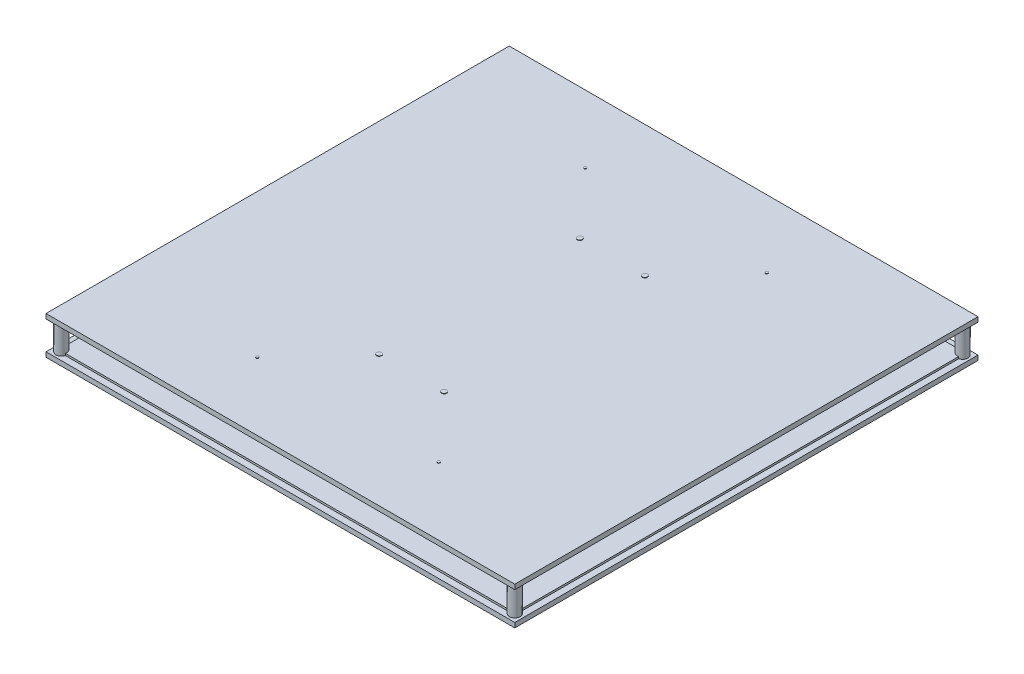
ISO-10303-21;
HEADER;
FILE_DESCRIPTION(('STEP AP214'),'2;1');
FILE_NAME('part.step','',(''),(''),'','','');
FILE_SCHEMA(('AUTOMOTIVE_DESIGN { 1 0 10303 214 1 1 1 1 }'));
ENDSEC;
DATA;
#1=APPLICATION_CONTEXT('core data for automotive mechanical design processes');
#2=APPLICATION_PROTOCOL_DEFINITION('international standard','automotive_design',2000,#1);
#3=PRODUCT_CONTEXT('',#1,'mechanical');
#4=PRODUCT('Part','Part','',(#3));
#5=PRODUCT_RELATED_PRODUCT_CATEGORY('part','',(#4));
#6=PRODUCT_DEFINITION_FORMATION('','',#4);
#7=PRODUCT_DEFINITION_CONTEXT('part definition',#1,'design');
#8=PRODUCT_DEFINITION('design','',#6,#7);
#9=PRODUCT_DEFINITION_SHAPE('','',#8);
#10=(LENGTH_UNIT() NAMED_UNIT(*) SI_UNIT(.MILLI.,.METRE.));
#11=(NAMED_UNIT(*) PLANE_ANGLE_UNIT() SI_UNIT($,.RADIAN.));
#12=(NAMED_UNIT(*) SI_UNIT($,.STERADIAN.) SOLID_ANGLE_UNIT());
#13=UNCERTAINTY_MEASURE_WITH_UNIT(LENGTH_MEASURE(1.E-05),#10,'distance_accuracy_value','');
#14=(GEOMETRIC_REPRESENTATION_CONTEXT(3) GLOBAL_UNCERTAINTY_ASSIGNED_CONTEXT((#13)) GLOBAL_UNIT_ASSIGNED_CONTEXT((#10,
#11,#12)) REPRESENTATION_CONTEXT('',''));
#15=CARTESIAN_POINT('',(0.,0.,0.));
#16=DIRECTION('',(0.,0.,1.));
#17=DIRECTION('',(1.,0.,0.));
#18=AXIS2_PLACEMENT_3D('',#15,#16,#17);
#19=CARTESIAN_POINT('',(151.154277778757,4.445,149.310271544904));
#20=DIRECTION('',(0.,0.,1.));
#21=DIRECTION('',(1.,0.,0.));
#22=AXIS2_PLACEMENT_3D('',#19,#20,#21);
#23=PLANE('',#22);
#24=DIRECTION('',(0.,-1.,0.));
#25=VECTOR('',#24,1.);
#26=CARTESIAN_POINT('',(-146.860277327342,23.876,149.310271544904));
#27=LINE('',#26,#25);
#28=CARTESIAN_POINT('',(-146.860277327342,3.175,149.310271544904));
#29=VERTEX_POINT('',#28);
#30=CARTESIAN_POINT('',(-146.860277327342,4.445,149.310271544904));
#31=VERTEX_POINT('',#30);
#32=EDGE_CURVE('E70',#29,#31,#27,.F.);
#33=ORIENTED_EDGE('',*,*,#32,.F.);
#34=DIRECTION('',(-1.,0.,0.));
#35=VECTOR('',#34,1.);
#36=CARTESIAN_POINT('',(151.154277778757,3.175,149.310271544904));
#37=LINE('',#36,#35);
#38=CARTESIAN_POINT('',(146.860277327342,3.175,149.310271544904));
#39=VERTEX_POINT('',#38);
#40=EDGE_CURVE('E325',#39,#29,#37,.T.);
#41=ORIENTED_EDGE('',*,*,#40,.F.);
#42=DIRECTION('',(0.,-1.,0.));
#43=VECTOR('',#42,1.);
#44=CARTESIAN_POINT('',(146.860277327342,23.876,149.310271544904));
#45=LINE('',#44,#43);
#46=CARTESIAN_POINT('',(146.860277327342,4.445,149.310271544904));
#47=VERTEX_POINT('',#46);
#48=EDGE_CURVE('E195',#39,#47,#45,.F.);
#49=ORIENTED_EDGE('',*,*,#48,.T.);
#50=DIRECTION('',(-1.,0.,0.));
#51=VECTOR('',#50,1.);
#52=CARTESIAN_POINT('',(151.154277778757,4.445,149.310271544904));
#53=LINE('',#52,#51);
#54=EDGE_CURVE('E174',#47,#31,#53,.T.);
#55=ORIENTED_EDGE('',*,*,#54,.T.);
#56=EDGE_LOOP('',(#33,#41,#49,#55));
#57=FACE_BOUND('',#56,.T.);
#58=ADVANCED_FACE('F47',(#57),#23,.T.);
#59=CARTESIAN_POINT('',(151.154277778757,4.445,-149.310271544904));
#60=DIRECTION('',(1.,0.,0.));
#61=DIRECTION('',(0.,0.,-1.));
#62=AXIS2_PLACEMENT_3D('',#59,#60,#61);
#63=PLANE('',#62);
#64=DIRECTION('',(0.,0.,1.));
#65=VECTOR('',#64,1.);
#66=CARTESIAN_POINT('',(151.154277778757,4.445,-149.310271544904));
#67=LINE('',#66,#65);
#68=CARTESIAN_POINT('',(151.154277778757,4.445,-145.016271093489));
#69=VERTEX_POINT('',#68);
#70=CARTESIAN_POINT('',(151.154277778757,4.445,145.016271093489));
#71=VERTEX_POINT('',#70);
#72=EDGE_CURVE('E329',#69,#71,#67,.T.);
#73=ORIENTED_EDGE('',*,*,#72,.T.);
#74=DIRECTION('',(0.,-1.,0.));
#75=VECTOR('',#74,1.);
#76=CARTESIAN_POINT('',(151.154277778757,23.876,145.016271093489));
#77=LINE('',#76,#75);
#78=CARTESIAN_POINT('',(151.154277778757,3.175,145.016271093489));
#79=VERTEX_POINT('',#78);
#80=EDGE_CURVE('E192',#71,#79,#77,.T.);
#81=ORIENTED_EDGE('',*,*,#80,.T.);
#82=DIRECTION('',(0.,0.,1.));
#83=VECTOR('',#82,1.);
#84=CARTESIAN_POINT('',(151.154277778757,3.175,-149.310271544904));
#85=LINE('',#84,#83);
#86=CARTESIAN_POINT('',(151.154277778757,3.175,-145.016271093489));
#87=VERTEX_POINT('',#86);
#88=EDGE_CURVE('E326',#87,#79,#85,.T.);
#89=ORIENTED_EDGE('',*,*,#88,.F.);
#90=DIRECTION('',(0.,-1.,0.));
#91=VECTOR('',#90,1.);
#92=CARTESIAN_POINT('',(151.154277778757,23.876,-145.016271093489));
#93=LINE('',#92,#91);
#94=EDGE_CURVE('E204',#69,#87,#93,.T.);
#95=ORIENTED_EDGE('',*,*,#94,.F.);
#96=EDGE_LOOP('',(#73,#81,#89,#95));
#97=FACE_BOUND('',#96,.T.);
#98=ADVANCED_FACE('F392',(#97),#63,.T.);
#99=CARTESIAN_POINT('',(151.154277778757,4.445,-149.310271544904));
#100=DIRECTION('',(0.,0.,1.));
#101=DIRECTION('',(1.,0.,0.));
#102=AXIS2_PLACEMENT_3D('',#99,#100,#101);
#103=PLANE('',#102);
#104=DIRECTION('',(-1.,0.,0.));
#105=VECTOR('',#104,1.);
#106=CARTESIAN_POINT('',(151.154277778757,4.445,-149.310271544904));
#107=LINE('',#106,#105);
#108=CARTESIAN_POINT('',(146.860277327342,4.445,-149.310271544904));
#109=VERTEX_POINT('',#108);
#110=CARTESIAN_POINT('',(-146.860277327342,4.445,-149.310271544904));
#111=VERTEX_POINT('',#110);
#112=EDGE_CURVE('E173',#109,#111,#107,.T.);
#113=ORIENTED_EDGE('',*,*,#112,.F.);
#114=DIRECTION('',(0.,-1.,0.));
#115=VECTOR('',#114,1.);
#116=CARTESIAN_POINT('',(146.860277327342,23.876,-149.310271544904));
#117=LINE('',#116,#115);
#118=CARTESIAN_POINT('',(146.860277327342,3.175,-149.310271544904));
#119=VERTEX_POINT('',#118);
#120=EDGE_CURVE('E210',#109,#119,#117,.T.);
#121=ORIENTED_EDGE('',*,*,#120,.T.);
#122=DIRECTION('',(-1.,0.,0.));
#123=VECTOR('',#122,1.);
#124=CARTESIAN_POINT('',(151.154277778757,3.175,-149.310271544904));
#125=LINE('',#124,#123);
#126=CARTESIAN_POINT('',(-146.860277327342,3.175,-149.310271544904));
#127=VERTEX_POINT('',#126);
#128=EDGE_CURVE('E335',#119,#127,#125,.T.);
#129=ORIENTED_EDGE('',*,*,#128,.T.);
#130=DIRECTION('',(0.,-1.,0.));
#131=VECTOR('',#130,1.);
#132=CARTESIAN_POINT('',(-146.860277327342,23.876,-149.310271544904));
#133=LINE('',#132,#131);
#134=EDGE_CURVE('E319',#111,#127,#133,.T.);
#135=ORIENTED_EDGE('',*,*,#134,.F.);
#136=EDGE_LOOP('',(#113,#121,#129,#135));
#137=FACE_BOUND('',#136,.T.);
#138=ADVANCED_FACE('F397',(#137),#103,.F.);
#139=CARTESIAN_POINT('',(-151.154277778757,4.445,-149.310271544904));
#140=DIRECTION('',(1.,0.,0.));
#141=DIRECTION('',(0.,0.,-1.));
#142=AXIS2_PLACEMENT_3D('',#139,#140,#141);
#143=PLANE('',#142);
#144=DIRECTION('',(0.,0.,1.));
#145=VECTOR('',#144,1.);
#146=CARTESIAN_POINT('',(-151.154277778757,3.175,-149.310271544904));
#147=LINE('',#146,#145);
#148=CARTESIAN_POINT('',(-151.154277778757,3.175,-145.016271093489));
#149=VERTEX_POINT('',#148);
#150=CARTESIAN_POINT('',(-151.154277778757,3.175,145.016271093489));
#151=VERTEX_POINT('',#150);
#152=EDGE_CURVE('E179',#149,#151,#147,.T.);
#153=ORIENTED_EDGE('',*,*,#152,.T.);
#154=DIRECTION('',(0.,-1.,0.));
#155=VECTOR('',#154,1.);
#156=CARTESIAN_POINT('',(-151.154277778757,23.876,145.016271093489));
#157=LINE('',#156,#155);
#158=CARTESIAN_POINT('',(-151.154277778757,4.445,145.016271093489));
#159=VERTEX_POINT('',#158);
#160=EDGE_CURVE('E177',#151,#159,#157,.F.);
#161=ORIENTED_EDGE('',*,*,#160,.T.);
#162=DIRECTION('',(0.,0.,1.));
#163=VECTOR('',#162,1.);
#164=CARTESIAN_POINT('',(-151.154277778757,4.445,-149.310271544904));
#165=LINE('',#164,#163);
#166=CARTESIAN_POINT('',(-151.154277778757,4.445,-145.016271093489));
#167=VERTEX_POINT('',#166);
#168=EDGE_CURVE('E163',#167,#159,#165,.T.);
#169=ORIENTED_EDGE('',*,*,#168,.F.);
#170=DIRECTION('',(0.,-1.,0.));
#171=VECTOR('',#170,1.);
#172=CARTESIAN_POINT('',(-151.154277778757,23.876,-145.016271093489));
#173=LINE('',#172,#171);
#174=EDGE_CURVE('E317',#149,#167,#173,.F.);
#175=ORIENTED_EDGE('',*,*,#174,.F.);
#176=EDGE_LOOP('',(#153,#161,#169,#175));
#177=FACE_BOUND('',#176,.T.);
#178=ADVANCED_FACE('F178',(#177),#143,.F.);
#179=CARTESIAN_POINT('',(0.,3.175,0.));
#180=DIRECTION('',(0.,1.,0.));
#181=DIRECTION('',(0.,0.,1.));
#182=AXIS2_PLACEMENT_3D('',#179,#180,#181);
#183=PLANE('',#182);
#184=CARTESIAN_POINT('',(-150.316077778757,3.175,148.472071544904));
#185=DIRECTION('',(0.,1.,0.));
#186=DIRECTION('',(0.,0.,1.));
#187=AXIS2_PLACEMENT_3D('',#184,#185,#186);
#188=CIRCLE('',#187,3.55600000000001);
#189=EDGE_CURVE('E62',#151,#29,#188,.T.);
#190=ORIENTED_EDGE('',*,*,#189,.F.);
#191=ORIENTED_EDGE('',*,*,#152,.F.);
#192=CARTESIAN_POINT('',(-150.316077778757,3.175,-148.472071544904));
#193=DIRECTION('',(0.,1.,0.));
#194=DIRECTION('',(0.,0.,1.));
#195=AXIS2_PLACEMENT_3D('',#192,#193,#194);
#196=CIRCLE('',#195,3.55600000000001);
#197=EDGE_CURVE('E322',#149,#127,#196,.F.);
#198=ORIENTED_EDGE('',*,*,#197,.T.);
#199=ORIENTED_EDGE('',*,*,#128,.F.);
#200=CARTESIAN_POINT('',(150.316077778757,3.175,-148.472071544904));
#201=DIRECTION('',(0.,1.,0.));
#202=DIRECTION('',(0.,0.,1.));
#203=AXIS2_PLACEMENT_3D('',#200,#201,#202);
#204=CIRCLE('',#203,3.55600000000001);
#205=EDGE_CURVE('E207',#87,#119,#204,.T.);
#206=ORIENTED_EDGE('',*,*,#205,.F.);
#207=ORIENTED_EDGE('',*,*,#88,.T.);
#208=CARTESIAN_POINT('',(150.316077778757,3.175,148.472071544904));
#209=DIRECTION('',(0.,1.,0.));
#210=DIRECTION('',(0.,0.,1.));
#211=AXIS2_PLACEMENT_3D('',#208,#209,#210);
#212=CIRCLE('',#211,3.55600000000001);
#213=EDGE_CURVE('E198',#79,#39,#212,.F.);
#214=ORIENTED_EDGE('',*,*,#213,.T.);
#215=ORIENTED_EDGE('',*,*,#40,.T.);
#216=EDGE_LOOP('',(#190,#191,#198,#199,#206,#207,#214,#215));
#217=FACE_BOUND('',#216,.T.);
#218=DIRECTION('',(1.,0.,0.));
#219=VECTOR('',#218,1.);
#220=CARTESIAN_POINT('',(-155.396077778757,3.175,-153.552071544904));
#221=LINE('',#220,#219);
#222=CARTESIAN_POINT('',(-155.396077778757,3.175,-153.552071544904));
#223=VERTEX_POINT('',#222);
#224=CARTESIAN_POINT('',(155.396077778757,3.175,-153.552071544904));
#225=VERTEX_POINT('',#224);
#226=EDGE_CURVE('E339',#223,#225,#221,.T.);
#227=ORIENTED_EDGE('',*,*,#226,.F.);
#228=DIRECTION('',(0.,0.,-1.));
#229=VECTOR('',#228,1.);
#230=CARTESIAN_POINT('',(-155.396077778757,3.175,153.552071544904));
#231=LINE('',#230,#229);
#232=CARTESIAN_POINT('',(-155.396077778757,3.175,153.552071544904));
#233=VERTEX_POINT('',#232);
#234=EDGE_CURVE('E347',#233,#223,#231,.T.);
#235=ORIENTED_EDGE('',*,*,#234,.F.);
#236=DIRECTION('',(1.,0.,0.));
#237=VECTOR('',#236,1.);
#238=CARTESIAN_POINT('',(-155.396077778757,3.175,153.552071544904));
#239=LINE('',#238,#237);
#240=CARTESIAN_POINT('',(155.396077778757,3.175,153.552071544904));
#241=VERTEX_POINT('',#240);
#242=EDGE_CURVE('E345',#233,#241,#239,.T.);
#243=ORIENTED_EDGE('',*,*,#242,.T.);
#244=DIRECTION('',(0.,0.,-1.));
#245=VECTOR('',#244,1.);
#246=CARTESIAN_POINT('',(155.396077778757,3.175,153.552071544904));
#247=LINE('',#246,#245);
#248=EDGE_CURVE('E342',#241,#225,#247,.T.);
#249=ORIENTED_EDGE('',*,*,#248,.T.);
#250=EDGE_LOOP('',(#227,#235,#243,#249));
#251=FACE_BOUND('',#250,.T.);
#252=ADVANCED_FACE('F403',(#217,#251),#183,.T.);
#253=CARTESIAN_POINT('',(-155.396077778757,3.175,-153.552071544904));
#254=DIRECTION('',(0.,0.,-1.));
#255=DIRECTION('',(-1.,0.,0.));
#256=AXIS2_PLACEMENT_3D('',#253,#254,#255);
#257=PLANE('',#256);
#258=DIRECTION('',(1.,0.,0.));
#259=VECTOR('',#258,1.);
#260=CARTESIAN_POINT('',(-155.396077778757,0.,-153.552071544904));
#261=LINE('',#260,#259);
#262=CARTESIAN_POINT('',(-155.396077778757,0.,-153.552071544904));
#263=VERTEX_POINT('',#262);
#264=CARTESIAN_POINT('',(155.396077778757,0.,-153.552071544904));
#265=VERTEX_POINT('',#264);
#266=EDGE_CURVE('E332',#263,#265,#261,.T.);
#267=ORIENTED_EDGE('',*,*,#266,.F.);
#268=DIRECTION('',(0.,-1.,0.));
#269=VECTOR('',#268,1.);
#270=CARTESIAN_POINT('',(-155.396077778757,3.175,-153.552071544904));
#271=LINE('',#270,#269);
#272=EDGE_CURVE('E360',#223,#263,#271,.T.);
#273=ORIENTED_EDGE('',*,*,#272,.F.);
#274=ORIENTED_EDGE('',*,*,#226,.T.);
#275=DIRECTION('',(0.,-1.,0.));
#276=VECTOR('',#275,1.);
#277=CARTESIAN_POINT('',(155.396077778757,3.175,-153.552071544904));
#278=LINE('',#277,#276);
#279=EDGE_CURVE('E350',#225,#265,#278,.T.);
#280=ORIENTED_EDGE('',*,*,#279,.T.);
#281=EDGE_LOOP('',(#267,#273,#274,#280));
#282=FACE_BOUND('',#281,.T.);
#283=ADVANCED_FACE('F49',(#282),#257,.T.);
#284=CARTESIAN_POINT('',(-155.396077778757,3.175,153.552071544904));
#285=DIRECTION('',(-1.,0.,0.));
#286=DIRECTION('',(0.,0.,1.));
#287=AXIS2_PLACEMENT_3D('',#284,#285,#286);
#288=PLANE('',#287);
#289=DIRECTION('',(0.,0.,-1.));
#290=VECTOR('',#289,1.);
#291=CARTESIAN_POINT('',(-155.396077778757,0.,153.552071544904));
#292=LINE('',#291,#290);
#293=CARTESIAN_POINT('',(-155.396077778757,0.,153.552071544904));
#294=VERTEX_POINT('',#293);
#295=EDGE_CURVE('E343',#294,#263,#292,.T.);
#296=ORIENTED_EDGE('',*,*,#295,.F.);
#297=DIRECTION('',(0.,-1.,0.));
#298=VECTOR('',#297,1.);
#299=CARTESIAN_POINT('',(-155.396077778757,3.175,153.552071544904));
#300=LINE('',#299,#298);
#301=EDGE_CURVE('E362',#233,#294,#300,.T.);
#302=ORIENTED_EDGE('',*,*,#301,.F.);
#303=ORIENTED_EDGE('',*,*,#234,.T.);
#304=ORIENTED_EDGE('',*,*,#272,.T.);
#305=EDGE_LOOP('',(#296,#302,#303,#304));
#306=FACE_BOUND('',#305,.T.);
#307=ADVANCED_FACE('F411',(#306),#288,.T.);
#308=CARTESIAN_POINT('',(-155.396077778757,3.175,153.552071544904));
#309=DIRECTION('',(0.,0.,-1.));
#310=DIRECTION('',(-1.,0.,0.));
#311=AXIS2_PLACEMENT_3D('',#308,#309,#310);
#312=PLANE('',#311);
#313=DIRECTION('',(1.,0.,0.));
#314=VECTOR('',#313,1.);
#315=CARTESIAN_POINT('',(-155.396077778757,0.,153.552071544904));
#316=LINE('',#315,#314);
#317=CARTESIAN_POINT('',(155.396077778757,0.,153.552071544904));
#318=VERTEX_POINT('',#317);
#319=EDGE_CURVE('E356',#294,#318,#316,.T.);
#320=ORIENTED_EDGE('',*,*,#319,.T.);
#321=DIRECTION('',(0.,-1.,0.));
#322=VECTOR('',#321,1.);
#323=CARTESIAN_POINT('',(155.396077778757,3.175,153.552071544904));
#324=LINE('',#323,#322);
#325=EDGE_CURVE('E364',#241,#318,#324,.T.);
#326=ORIENTED_EDGE('',*,*,#325,.F.);
#327=ORIENTED_EDGE('',*,*,#242,.F.);
#328=ORIENTED_EDGE('',*,*,#301,.T.);
#329=EDGE_LOOP('',(#320,#326,#327,#328));
#330=FACE_BOUND('',#329,.T.);
#331=ADVANCED_FACE('F414',(#330),#312,.F.);
#332=CARTESIAN_POINT('',(155.396077778757,3.175,153.552071544904));
#333=DIRECTION('',(-1.,0.,0.));
#334=DIRECTION('',(0.,0.,1.));
#335=AXIS2_PLACEMENT_3D('',#332,#333,#334);
#336=PLANE('',#335);
#337=DIRECTION('',(0.,0.,-1.));
#338=VECTOR('',#337,1.);
#339=CARTESIAN_POINT('',(155.396077778757,0.,153.552071544904));
#340=LINE('',#339,#338);
#341=EDGE_CURVE('E353',#318,#265,#340,.T.);
#342=ORIENTED_EDGE('',*,*,#341,.T.);
#343=ORIENTED_EDGE('',*,*,#279,.F.);
#344=ORIENTED_EDGE('',*,*,#248,.F.);
#345=ORIENTED_EDGE('',*,*,#325,.T.);
#346=EDGE_LOOP('',(#342,#343,#344,#345));
#347=FACE_BOUND('',#346,.T.);
#348=ADVANCED_FACE('F409',(#347),#336,.F.);
#349=CARTESIAN_POINT('',(0.,0.,0.));
#350=DIRECTION('',(0.,1.,0.));
#351=DIRECTION('',(0.,0.,1.));
#352=AXIS2_PLACEMENT_3D('',#349,#350,#351);
#353=PLANE('',#352);
#354=ORIENTED_EDGE('',*,*,#266,.T.);
#355=ORIENTED_EDGE('',*,*,#341,.F.);
#356=ORIENTED_EDGE('',*,*,#319,.F.);
#357=ORIENTED_EDGE('',*,*,#295,.T.);
#358=EDGE_LOOP('',(#354,#355,#356,#357));
#359=FACE_BOUND('',#358,.T.);
#360=ADVANCED_FACE('F406',(#359),#353,.F.);
#361=CARTESIAN_POINT('',(0.,4.445,0.));
#362=DIRECTION('',(0.,1.,0.));
#363=DIRECTION('',(0.,0.,1.));
#364=AXIS2_PLACEMENT_3D('',#361,#362,#363);
#365=PLANE('',#364);
#366=CARTESIAN_POINT('',(-150.316077778757,4.445,148.472071544904));
#367=DIRECTION('',(0.,1.,0.));
#368=DIRECTION('',(0.,0.,1.));
#369=AXIS2_PLACEMENT_3D('',#366,#367,#368);
#370=CIRCLE('',#369,3.55600000000001);
#371=EDGE_CURVE('E168',#31,#159,#370,.T.);
#372=ORIENTED_EDGE('',*,*,#371,.F.);
#373=ORIENTED_EDGE('',*,*,#54,.F.);
#374=CARTESIAN_POINT('',(150.316077778757,4.445,148.472071544904));
#375=DIRECTION('',(0.,1.,0.));
#376=DIRECTION('',(0.,0.,1.));
#377=AXIS2_PLACEMENT_3D('',#374,#375,#376);
#378=CIRCLE('',#377,3.55600000000001);
#379=EDGE_CURVE('E189',#47,#71,#378,.F.);
#380=ORIENTED_EDGE('',*,*,#379,.T.);
#381=ORIENTED_EDGE('',*,*,#72,.F.);
#382=CARTESIAN_POINT('',(150.316077778757,4.445,-148.472071544904));
#383=DIRECTION('',(0.,1.,0.));
#384=DIRECTION('',(0.,0.,1.));
#385=AXIS2_PLACEMENT_3D('',#382,#383,#384);
#386=CIRCLE('',#385,3.55600000000001);
#387=EDGE_CURVE('E201',#109,#69,#386,.T.);
#388=ORIENTED_EDGE('',*,*,#387,.F.);
#389=ORIENTED_EDGE('',*,*,#112,.T.);
#390=CARTESIAN_POINT('',(-150.316077778757,4.445,-148.472071544904));
#391=DIRECTION('',(0.,1.,0.));
#392=DIRECTION('',(0.,0.,1.));
#393=AXIS2_PLACEMENT_3D('',#390,#391,#392);
#394=CIRCLE('',#393,3.55600000000001);
#395=EDGE_CURVE('E170',#111,#167,#394,.F.);
#396=ORIENTED_EDGE('',*,*,#395,.T.);
#397=ORIENTED_EDGE('',*,*,#168,.T.);
#398=EDGE_LOOP('',(#372,#373,#380,#381,#388,#389,#396,#397));
#399=FACE_BOUND('',#398,.T.);
#400=ADVANCED_FACE('F165',(#399),#365,.T.);
#401=CARTESIAN_POINT('',(-150.316077778757,23.876,-148.472071544904));
#402=DIRECTION('',(0.,-1.,0.));
#403=DIRECTION('',(0.,0.,-1.));
#404=AXIS2_PLACEMENT_3D('',#401,#402,#403);
#405=CYLINDRICAL_SURFACE('',#404,3.55600000000001);
#406=CARTESIAN_POINT('',(-150.316077778757,21.9964,-148.472071544904));
#407=DIRECTION('',(0.,-1.,0.));
#408=DIRECTION('',(0.,0.,-1.));
#409=AXIS2_PLACEMENT_3D('',#406,#407,#408);
#410=CIRCLE('',#409,3.55600000000001);
#411=CARTESIAN_POINT('',(-150.316077778757,21.9964,-152.028071544904));
#412=VERTEX_POINT('',#411);
#413=EDGE_CURVE('E316',#412,#412,#410,.T.);
#414=ORIENTED_EDGE('',*,*,#413,.T.);
#415=EDGE_LOOP('',(#414));
#416=FACE_BOUND('',#415,.T.);
#417=ORIENTED_EDGE('',*,*,#197,.F.);
#418=ORIENTED_EDGE('',*,*,#174,.T.);
#419=ORIENTED_EDGE('',*,*,#395,.F.);
#420=ORIENTED_EDGE('',*,*,#134,.T.);
#421=EDGE_LOOP('',(#417,#418,#419,#420));
#422=FACE_BOUND('',#421,.T.);
#423=ADVANCED_FACE('F499',(#416,#422),#405,.T.);
#424=CARTESIAN_POINT('',(0.,21.9964,0.));
#425=DIRECTION('',(0.,-1.,0.));
#426=DIRECTION('',(0.,0.,-1.));
#427=AXIS2_PLACEMENT_3D('',#424,#425,#426);
#428=PLANE('',#427);
#429=CARTESIAN_POINT('',(-150.316077778757,21.9964,148.472071544904));
#430=DIRECTION('',(0.,-1.,0.));
#431=DIRECTION('',(0.,0.,-1.));
#432=AXIS2_PLACEMENT_3D('',#429,#430,#431);
#433=CIRCLE('',#432,3.55600000000001);
#434=CARTESIAN_POINT('',(-150.316077778757,21.9964,144.916071544904));
#435=VERTEX_POINT('',#434);
#436=EDGE_CURVE('E13',#435,#435,#433,.T.);
#437=ORIENTED_EDGE('',*,*,#436,.F.);
#438=EDGE_LOOP('',(#437));
#439=FACE_BOUND('',#438,.T.);
#440=CARTESIAN_POINT('',(150.316077778757,21.9964,148.472071544904));
#441=DIRECTION('',(0.,-1.,0.));
#442=DIRECTION('',(0.,0.,-1.));
#443=AXIS2_PLACEMENT_3D('',#440,#441,#442);
#444=CIRCLE('',#443,3.55600000000001);
#445=CARTESIAN_POINT('',(150.316077778757,21.9964,144.916071544904));
#446=VERTEX_POINT('',#445);
#447=EDGE_CURVE('E188',#446,#446,#444,.F.);
#448=ORIENTED_EDGE('',*,*,#447,.T.);
#449=EDGE_LOOP('',(#448));
#450=FACE_BOUND('',#449,.T.);
#451=CARTESIAN_POINT('',(150.316077778757,21.9964,-148.472071544904));
#452=DIRECTION('',(0.,-1.,0.));
#453=DIRECTION('',(0.,0.,-1.));
#454=AXIS2_PLACEMENT_3D('',#451,#452,#453);
#455=CIRCLE('',#454,3.55600000000001);
#456=CARTESIAN_POINT('',(150.316077778757,21.9964,-152.028071544904));
#457=VERTEX_POINT('',#456);
#458=EDGE_CURVE('E55',#457,#457,#455,.T.);
#459=ORIENTED_EDGE('',*,*,#458,.F.);
#460=EDGE_LOOP('',(#459));
#461=FACE_BOUND('',#460,.T.);
#462=ORIENTED_EDGE('',*,*,#413,.F.);
#463=EDGE_LOOP('',(#462));
#464=FACE_BOUND('',#463,.T.);
#465=DIRECTION('',(-1.,0.,0.));
#466=VECTOR('',#465,1.);
#467=CARTESIAN_POINT('',(155.396077778757,21.9964,-153.552071544904));
#468=LINE('',#467,#466);
#469=CARTESIAN_POINT('',(155.396077778757,21.9964,-153.552071544904));
#470=VERTEX_POINT('',#469);
#471=CARTESIAN_POINT('',(-155.396077778757,21.9964,-153.552071544904));
#472=VERTEX_POINT('',#471);
#473=EDGE_CURVE('E265',#470,#472,#468,.T.);
#474=ORIENTED_EDGE('',*,*,#473,.F.);
#475=DIRECTION('',(0.,0.,-1.));
#476=VECTOR('',#475,1.);
#477=CARTESIAN_POINT('',(155.396077778757,21.9964,153.552071544904));
#478=LINE('',#477,#476);
#479=CARTESIAN_POINT('',(155.396077778757,21.9964,153.552071544904));
#480=VERTEX_POINT('',#479);
#481=EDGE_CURVE('E248',#480,#470,#478,.T.);
#482=ORIENTED_EDGE('',*,*,#481,.F.);
#483=DIRECTION('',(1.,0.,0.));
#484=VECTOR('',#483,1.);
#485=CARTESIAN_POINT('',(-155.396077778757,21.9964,153.552071544904));
#486=LINE('',#485,#484);
#487=CARTESIAN_POINT('',(-155.396077778757,21.9964,153.552071544904));
#488=VERTEX_POINT('',#487);
#489=EDGE_CURVE('E252',#488,#480,#486,.T.);
#490=ORIENTED_EDGE('',*,*,#489,.F.);
#491=DIRECTION('',(0.,0.,1.));
#492=VECTOR('',#491,1.);
#493=CARTESIAN_POINT('',(-155.396077778757,21.9964,-153.552071544904));
#494=LINE('',#493,#492);
#495=EDGE_CURVE('E272',#472,#488,#494,.T.);
#496=ORIENTED_EDGE('',*,*,#495,.F.);
#497=EDGE_LOOP('',(#474,#482,#490,#496));
#498=FACE_BOUND('',#497,.T.);
#499=ADVANCED_FACE('F375',(#439,#450,#461,#464,#498),#428,.T.);
#500=CARTESIAN_POINT('',(0.,25.1714,0.));
#501=DIRECTION('',(0.,-1.,0.));
#502=DIRECTION('',(0.,0.,-1.));
#503=AXIS2_PLACEMENT_3D('',#500,#501,#502);
#504=PLANE('',#503);
#505=CARTESIAN_POINT('',(60.1460777787568,25.1714,108.716299119564));
#506=DIRECTION('',(0.,-1.,0.));
#507=DIRECTION('',(0.,0.,-1.));
#508=AXIS2_PLACEMENT_3D('',#505,#506,#507);
#509=CIRCLE('',#508,0.911045745730185);
#510=CARTESIAN_POINT('',(60.1460777787568,25.1714,107.805253373834));
#511=VERTEX_POINT('',#510);
#512=EDGE_CURVE('E213',#511,#511,#509,.T.);
#513=ORIENTED_EDGE('',*,*,#512,.T.);
#514=EDGE_LOOP('',(#513));
#515=FACE_BOUND('',#514,.T.);
#516=CARTESIAN_POINT('',(21.5380777787568,25.1714,66.5522991195644));
#517=DIRECTION('',(0.,-1.,0.));
#518=DIRECTION('',(0.,0.,-1.));
#519=AXIS2_PLACEMENT_3D('',#516,#517,#518);
#520=CIRCLE('',#519,1.6837403917797);
#521=CARTESIAN_POINT('',(21.5380777787568,25.1714,64.8685587277847));
#522=VERTEX_POINT('',#521);
#523=EDGE_CURVE('E219',#522,#522,#520,.T.);
#524=ORIENTED_EDGE('',*,*,#523,.T.);
#525=EDGE_LOOP('',(#524));
#526=FACE_BOUND('',#525,.T.);
#527=CARTESIAN_POINT('',(60.1460777787568,25.1714,-108.716299119564));
#528=DIRECTION('',(0.,-1.,0.));
#529=DIRECTION('',(0.,0.,-1.));
#530=AXIS2_PLACEMENT_3D('',#527,#528,#529);
#531=CIRCLE('',#530,0.911045745730185);
#532=CARTESIAN_POINT('',(60.1460777787568,25.1714,-109.627344865295));
#533=VERTEX_POINT('',#532);
#534=EDGE_CURVE('E313',#533,#533,#531,.F.);
#535=ORIENTED_EDGE('',*,*,#534,.F.);
#536=EDGE_LOOP('',(#535));
#537=FACE_BOUND('',#536,.T.);
#538=CARTESIAN_POINT('',(21.5380777787568,25.1714,-66.5522991195644));
#539=DIRECTION('',(0.,-1.,0.));
#540=DIRECTION('',(0.,0.,-1.));
#541=AXIS2_PLACEMENT_3D('',#538,#539,#540);
#542=CIRCLE('',#541,1.6837403917797);
#543=CARTESIAN_POINT('',(21.5380777787568,25.1714,-68.2360395113441));
#544=VERTEX_POINT('',#543);
#545=EDGE_CURVE('E310',#544,#544,#542,.F.);
#546=ORIENTED_EDGE('',*,*,#545,.F.);
#547=EDGE_LOOP('',(#546));
#548=FACE_BOUND('',#547,.T.);
#549=CARTESIAN_POINT('',(-21.5380777787568,25.1714,-66.5522991195644));
#550=DIRECTION('',(0.,-1.,0.));
#551=DIRECTION('',(0.,0.,-1.));
#552=AXIS2_PLACEMENT_3D('',#549,#550,#551);
#553=CIRCLE('',#552,1.6837403917797);
#554=CARTESIAN_POINT('',(-21.5380777787568,25.1714,-68.2360395113441));
#555=VERTEX_POINT('',#554);
#556=EDGE_CURVE('E231',#555,#555,#553,.T.);
#557=ORIENTED_EDGE('',*,*,#556,.T.);
#558=EDGE_LOOP('',(#557));
#559=FACE_BOUND('',#558,.T.);
#560=CARTESIAN_POINT('',(-60.1460777787567,25.1714,-108.716299119564));
#561=DIRECTION('',(0.,-1.,0.));
#562=DIRECTION('',(0.,0.,-1.));
#563=AXIS2_PLACEMENT_3D('',#560,#561,#562);
#564=CIRCLE('',#563,0.911045745730185);
#565=CARTESIAN_POINT('',(-60.1460777787567,25.1714,-109.627344865295));
#566=VERTEX_POINT('',#565);
#567=EDGE_CURVE('E237',#566,#566,#564,.T.);
#568=ORIENTED_EDGE('',*,*,#567,.T.);
#569=EDGE_LOOP('',(#568));
#570=FACE_BOUND('',#569,.T.);
#571=CARTESIAN_POINT('',(-21.5380777787568,25.1714,66.5522991195644));
#572=DIRECTION('',(0.,-1.,0.));
#573=DIRECTION('',(0.,0.,-1.));
#574=AXIS2_PLACEMENT_3D('',#571,#572,#573);
#575=CIRCLE('',#574,1.6837403917797);
#576=CARTESIAN_POINT('',(-21.5380777787568,25.1714,64.8685587277847));
#577=VERTEX_POINT('',#576);
#578=EDGE_CURVE('E307',#577,#577,#575,.F.);
#579=ORIENTED_EDGE('',*,*,#578,.F.);
#580=EDGE_LOOP('',(#579));
#581=FACE_BOUND('',#580,.T.);
#582=CARTESIAN_POINT('',(-60.1460777787567,25.1714,108.716299119564));
#583=DIRECTION('',(0.,-1.,0.));
#584=DIRECTION('',(0.,0.,-1.));
#585=AXIS2_PLACEMENT_3D('',#582,#583,#584);
#586=CIRCLE('',#585,0.911045745730185);
#587=CARTESIAN_POINT('',(-60.1460777787567,25.1714,107.805253373834));
#588=VERTEX_POINT('',#587);
#589=EDGE_CURVE('E264',#588,#588,#586,.F.);
#590=ORIENTED_EDGE('',*,*,#589,.F.);
#591=EDGE_LOOP('',(#590));
#592=FACE_BOUND('',#591,.T.);
#593=DIRECTION('',(-1.,0.,0.));
#594=VECTOR('',#593,1.);
#595=CARTESIAN_POINT('',(155.396077778757,25.1714,-153.552071544904));
#596=LINE('',#595,#594);
#597=CARTESIAN_POINT('',(155.396077778757,25.1714,-153.552071544904));
#598=VERTEX_POINT('',#597);
#599=CARTESIAN_POINT('',(-155.396077778757,25.1714,-153.552071544904));
#600=VERTEX_POINT('',#599);
#601=EDGE_CURVE('E261',#598,#600,#596,.T.);
#602=ORIENTED_EDGE('',*,*,#601,.T.);
#603=DIRECTION('',(0.,0.,1.));
#604=VECTOR('',#603,1.);
#605=CARTESIAN_POINT('',(-155.396077778757,25.1714,-153.552071544904));
#606=LINE('',#605,#604);
#607=CARTESIAN_POINT('',(-155.396077778757,25.1714,153.552071544904));
#608=VERTEX_POINT('',#607);
#609=EDGE_CURVE('E271',#600,#608,#606,.T.);
#610=ORIENTED_EDGE('',*,*,#609,.T.);
#611=DIRECTION('',(1.,0.,0.));
#612=VECTOR('',#611,1.);
#613=CARTESIAN_POINT('',(-155.396077778757,25.1714,153.552071544904));
#614=LINE('',#613,#612);
#615=CARTESIAN_POINT('',(155.396077778757,25.1714,153.552071544904));
#616=VERTEX_POINT('',#615);
#617=EDGE_CURVE('E286',#608,#616,#614,.T.);
#618=ORIENTED_EDGE('',*,*,#617,.T.);
#619=DIRECTION('',(0.,0.,-1.));
#620=VECTOR('',#619,1.);
#621=CARTESIAN_POINT('',(155.396077778757,25.1714,153.552071544904));
#622=LINE('',#621,#620);
#623=EDGE_CURVE('E253',#616,#598,#622,.T.);
#624=ORIENTED_EDGE('',*,*,#623,.T.);
#625=EDGE_LOOP('',(#602,#610,#618,#624));
#626=FACE_BOUND('',#625,.T.);
#627=ADVANCED_FACE('F517',(#515,#526,#537,#548,#559,#570,#581,#592,#626),#504,.F.);
#628=CARTESIAN_POINT('',(155.396077778757,25.1714,153.552071544904));
#629=DIRECTION('',(-1.,0.,0.));
#630=DIRECTION('',(0.,0.,1.));
#631=AXIS2_PLACEMENT_3D('',#628,#629,#630);
#632=PLANE('',#631);
#633=ORIENTED_EDGE('',*,*,#481,.T.);
#634=DIRECTION('',(0.,-1.,0.));
#635=VECTOR('',#634,1.);
#636=CARTESIAN_POINT('',(155.396077778757,25.1714,-153.552071544904));
#637=LINE('',#636,#635);
#638=EDGE_CURVE('E249',#598,#470,#637,.T.);
#639=ORIENTED_EDGE('',*,*,#638,.F.);
#640=ORIENTED_EDGE('',*,*,#623,.F.);
#641=DIRECTION('',(0.,-1.,0.));
#642=VECTOR('',#641,1.);
#643=CARTESIAN_POINT('',(155.396077778757,25.1714,153.552071544904));
#644=LINE('',#643,#642);
#645=EDGE_CURVE('E258',#616,#480,#644,.T.);
#646=ORIENTED_EDGE('',*,*,#645,.T.);
#647=EDGE_LOOP('',(#633,#639,#640,#646));
#648=FACE_BOUND('',#647,.T.);
#649=ADVANCED_FACE('F528',(#648),#632,.F.);
#650=CARTESIAN_POINT('',(-155.396077778757,25.1714,153.552071544904));
#651=DIRECTION('',(0.,0.,-1.));
#652=DIRECTION('',(-1.,0.,0.));
#653=AXIS2_PLACEMENT_3D('',#650,#651,#652);
#654=PLANE('',#653);
#655=ORIENTED_EDGE('',*,*,#489,.T.);
#656=ORIENTED_EDGE('',*,*,#645,.F.);
#657=ORIENTED_EDGE('',*,*,#617,.F.);
#658=DIRECTION('',(0.,-1.,0.));
#659=VECTOR('',#658,1.);
#660=CARTESIAN_POINT('',(-155.396077778757,25.1714,153.552071544904));
#661=LINE('',#660,#659);
#662=EDGE_CURVE('E289',#608,#488,#661,.T.);
#663=ORIENTED_EDGE('',*,*,#662,.T.);
#664=EDGE_LOOP('',(#655,#656,#657,#663));
#665=FACE_BOUND('',#664,.T.);
#666=ADVANCED_FACE('F538',(#665),#654,.F.);
#667=CARTESIAN_POINT('',(-155.396077778757,25.1714,-153.552071544904));
#668=DIRECTION('',(1.,0.,0.));
#669=DIRECTION('',(0.,0.,-1.));
#670=AXIS2_PLACEMENT_3D('',#667,#668,#669);
#671=PLANE('',#670);
#672=ORIENTED_EDGE('',*,*,#495,.T.);
#673=ORIENTED_EDGE('',*,*,#662,.F.);
#674=ORIENTED_EDGE('',*,*,#609,.F.);
#675=DIRECTION('',(0.,-1.,0.));
#676=VECTOR('',#675,1.);
#677=CARTESIAN_POINT('',(-155.396077778757,25.1714,-153.552071544904));
#678=LINE('',#677,#676);
#679=EDGE_CURVE('E268',#600,#472,#678,.T.);
#680=ORIENTED_EDGE('',*,*,#679,.T.);
#681=EDGE_LOOP('',(#672,#673,#674,#680));
#682=FACE_BOUND('',#681,.T.);
#683=ADVANCED_FACE('F548',(#682),#671,.F.);
#684=CARTESIAN_POINT('',(155.396077778757,25.1714,-153.552071544904));
#685=DIRECTION('',(0.,0.,1.));
#686=DIRECTION('',(1.,0.,0.));
#687=AXIS2_PLACEMENT_3D('',#684,#685,#686);
#688=PLANE('',#687);
#689=ORIENTED_EDGE('',*,*,#473,.T.);
#690=ORIENTED_EDGE('',*,*,#679,.F.);
#691=ORIENTED_EDGE('',*,*,#601,.F.);
#692=ORIENTED_EDGE('',*,*,#638,.T.);
#693=EDGE_LOOP('',(#689,#690,#691,#692));
#694=FACE_BOUND('',#693,.T.);
#695=ADVANCED_FACE('F509',(#694),#688,.F.);
#696=CARTESIAN_POINT('',(-60.1460777787567,25.4254,108.716299119564));
#697=DIRECTION('',(0.,-1.,0.));
#698=DIRECTION('',(0.,0.,-1.));
#699=AXIS2_PLACEMENT_3D('',#696,#697,#698);
#700=CYLINDRICAL_SURFACE('',#699,0.911045745730185);
#701=CARTESIAN_POINT('',(-60.1460777787567,25.4254,108.716299119564));
#702=DIRECTION('',(0.,1.,0.));
#703=DIRECTION('',(0.,0.,1.));
#704=AXIS2_PLACEMENT_3D('',#701,#702,#703);
#705=CIRCLE('',#704,0.911045745730185);
#706=CARTESIAN_POINT('',(-60.1460777787567,25.4254,109.627344865295));
#707=VERTEX_POINT('',#706);
#708=EDGE_CURVE('E245',#707,#707,#705,.T.);
#709=ORIENTED_EDGE('',*,*,#708,.F.);
#710=EDGE_LOOP('',(#709));
#711=FACE_BOUND('',#710,.T.);
#712=ORIENTED_EDGE('',*,*,#589,.T.);
#713=EDGE_LOOP('',(#712));
#714=FACE_BOUND('',#713,.T.);
#715=ADVANCED_FACE('F520',(#711,#714),#700,.T.);
#716=CARTESIAN_POINT('',(0.,25.4254,0.));
#717=DIRECTION('',(0.,1.,0.));
#718=DIRECTION('',(0.,0.,1.));
#719=AXIS2_PLACEMENT_3D('',#716,#717,#718);
#720=PLANE('',#719);
#721=ORIENTED_EDGE('',*,*,#708,.T.);
#722=EDGE_LOOP('',(#721));
#723=FACE_BOUND('',#722,.T.);
#724=ADVANCED_FACE('F576',(#723),#720,.T.);
#725=CARTESIAN_POINT('',(-21.5380777787568,25.4254,66.5522991195644));
#726=DIRECTION('',(0.,-1.,0.));
#727=DIRECTION('',(0.,0.,-1.));
#728=AXIS2_PLACEMENT_3D('',#725,#726,#727);
#729=CYLINDRICAL_SURFACE('',#728,1.6837403917797);
#730=CARTESIAN_POINT('',(-21.5380777787568,25.4254,66.5522991195644));
#731=DIRECTION('',(0.,1.,0.));
#732=DIRECTION('',(0.,0.,1.));
#733=AXIS2_PLACEMENT_3D('',#730,#731,#732);
#734=CIRCLE('',#733,1.6837403917797);
#735=CARTESIAN_POINT('',(-21.5380777787568,25.4254,68.2360395113441));
#736=VERTEX_POINT('',#735);
#737=EDGE_CURVE('E240',#736,#736,#734,.T.);
#738=ORIENTED_EDGE('',*,*,#737,.F.);
#739=EDGE_LOOP('',(#738));
#740=FACE_BOUND('',#739,.T.);
#741=ORIENTED_EDGE('',*,*,#578,.T.);
#742=EDGE_LOOP('',(#741));
#743=FACE_BOUND('',#742,.T.);
#744=ADVANCED_FACE('F586',(#740,#743),#729,.T.);
#745=CARTESIAN_POINT('',(0.,25.4254,0.));
#746=DIRECTION('',(0.,1.,0.));
#747=DIRECTION('',(0.,0.,1.));
#748=AXIS2_PLACEMENT_3D('',#745,#746,#747);
#749=PLANE('',#748);
#750=ORIENTED_EDGE('',*,*,#737,.T.);
#751=EDGE_LOOP('',(#750));
#752=FACE_BOUND('',#751,.T.);
#753=ADVANCED_FACE('F596',(#752),#749,.T.);
#754=CARTESIAN_POINT('',(-60.1460777787567,25.4254,-108.716299119564));
#755=DIRECTION('',(0.,-1.,0.));
#756=DIRECTION('',(0.,0.,-1.));
#757=AXIS2_PLACEMENT_3D('',#754,#755,#756);
#758=CYLINDRICAL_SURFACE('',#757,0.911045745730185);
#759=CARTESIAN_POINT('',(-60.1460777787567,25.4254,-108.716299119564));
#760=DIRECTION('',(0.,-1.,0.));
#761=DIRECTION('',(0.,0.,-1.));
#762=AXIS2_PLACEMENT_3D('',#759,#760,#761);
#763=CIRCLE('',#762,0.911045745730185);
#764=CARTESIAN_POINT('',(-60.1460777787567,25.4254,-109.627344865295));
#765=VERTEX_POINT('',#764);
#766=EDGE_CURVE('E234',#765,#765,#763,.T.);
#767=ORIENTED_EDGE('',*,*,#766,.T.);
#768=EDGE_LOOP('',(#767));
#769=FACE_BOUND('',#768,.T.);
#770=ORIENTED_EDGE('',*,*,#567,.F.);
#771=EDGE_LOOP('',(#770));
#772=FACE_BOUND('',#771,.T.);
#773=ADVANCED_FACE('F607',(#769,#772),#758,.T.);
#774=CARTESIAN_POINT('',(-60.1460777787567,25.4254,-108.716299119564));
#775=DIRECTION('',(0.,-1.,0.));
#776=DIRECTION('',(0.,0.,-1.));
#777=AXIS2_PLACEMENT_3D('',#774,#775,#776);
#778=PLANE('',#777);
#779=ORIENTED_EDGE('',*,*,#766,.F.);
#780=EDGE_LOOP('',(#779));
#781=FACE_BOUND('',#780,.T.);
#782=ADVANCED_FACE('F618',(#781),#778,.F.);
#783=CARTESIAN_POINT('',(-21.5380777787568,25.4254,-66.5522991195644));
#784=DIRECTION('',(0.,-1.,0.));
#785=DIRECTION('',(0.,0.,-1.));
#786=AXIS2_PLACEMENT_3D('',#783,#784,#785);
#787=CYLINDRICAL_SURFACE('',#786,1.6837403917797);
#788=CARTESIAN_POINT('',(-21.5380777787568,25.4254,-66.5522991195644));
#789=DIRECTION('',(0.,-1.,0.));
#790=DIRECTION('',(0.,0.,-1.));
#791=AXIS2_PLACEMENT_3D('',#788,#789,#790);
#792=CIRCLE('',#791,1.6837403917797);
#793=CARTESIAN_POINT('',(-21.5380777787568,25.4254,-68.2360395113441));
#794=VERTEX_POINT('',#793);
#795=EDGE_CURVE('E230',#794,#794,#792,.T.);
#796=ORIENTED_EDGE('',*,*,#795,.T.);
#797=EDGE_LOOP('',(#796));
#798=FACE_BOUND('',#797,.T.);
#799=ORIENTED_EDGE('',*,*,#556,.F.);
#800=EDGE_LOOP('',(#799));
#801=FACE_BOUND('',#800,.T.);
#802=ADVANCED_FACE('F628',(#798,#801),#787,.T.);
#803=CARTESIAN_POINT('',(-21.5380777787568,25.4254,-66.5522991195644));
#804=DIRECTION('',(0.,-1.,0.));
#805=DIRECTION('',(0.,0.,-1.));
#806=AXIS2_PLACEMENT_3D('',#803,#804,#805);
#807=PLANE('',#806);
#808=ORIENTED_EDGE('',*,*,#795,.F.);
#809=EDGE_LOOP('',(#808));
#810=FACE_BOUND('',#809,.T.);
#811=ADVANCED_FACE('F638',(#810),#807,.F.);
#812=CARTESIAN_POINT('',(21.5380777787568,25.4254,-66.5522991195644));
#813=DIRECTION('',(0.,-1.,0.));
#814=DIRECTION('',(0.,0.,-1.));
#815=AXIS2_PLACEMENT_3D('',#812,#813,#814);
#816=CYLINDRICAL_SURFACE('',#815,1.6837403917797);
#817=CARTESIAN_POINT('',(21.5380777787568,25.4254,-66.5522991195644));
#818=DIRECTION('',(0.,1.,0.));
#819=DIRECTION('',(0.,0.,1.));
#820=AXIS2_PLACEMENT_3D('',#817,#818,#819);
#821=CIRCLE('',#820,1.6837403917797);
#822=CARTESIAN_POINT('',(21.5380777787568,25.4254,-64.8685587277847));
#823=VERTEX_POINT('',#822);
#824=EDGE_CURVE('E227',#823,#823,#821,.T.);
#825=ORIENTED_EDGE('',*,*,#824,.F.);
#826=EDGE_LOOP('',(#825));
#827=FACE_BOUND('',#826,.T.);
#828=ORIENTED_EDGE('',*,*,#545,.T.);
#829=EDGE_LOOP('',(#828));
#830=FACE_BOUND('',#829,.T.);
#831=ADVANCED_FACE('F648',(#827,#830),#816,.T.);
#832=CARTESIAN_POINT('',(21.5380777787568,25.4254,-66.5522991195644));
#833=DIRECTION('',(0.,1.,0.));
#834=DIRECTION('',(0.,0.,1.));
#835=AXIS2_PLACEMENT_3D('',#832,#833,#834);
#836=PLANE('',#835);
#837=ORIENTED_EDGE('',*,*,#824,.T.);
#838=EDGE_LOOP('',(#837));
#839=FACE_BOUND('',#838,.T.);
#840=ADVANCED_FACE('F658',(#839),#836,.T.);
#841=CARTESIAN_POINT('',(60.1460777787568,25.4254,-108.716299119564));
#842=DIRECTION('',(0.,-1.,0.));
#843=DIRECTION('',(0.,0.,-1.));
#844=AXIS2_PLACEMENT_3D('',#841,#842,#843);
#845=CYLINDRICAL_SURFACE('',#844,0.911045745730185);
#846=CARTESIAN_POINT('',(60.1460777787568,25.4254,-108.716299119564));
#847=DIRECTION('',(0.,1.,0.));
#848=DIRECTION('',(0.,0.,1.));
#849=AXIS2_PLACEMENT_3D('',#846,#847,#848);
#850=CIRCLE('',#849,0.911045745730185);
#851=CARTESIAN_POINT('',(60.1460777787568,25.4254,-107.805253373834));
#852=VERTEX_POINT('',#851);
#853=EDGE_CURVE('E222',#852,#852,#850,.T.);
#854=ORIENTED_EDGE('',*,*,#853,.F.);
#855=EDGE_LOOP('',(#854));
#856=FACE_BOUND('',#855,.T.);
#857=ORIENTED_EDGE('',*,*,#534,.T.);
#858=EDGE_LOOP('',(#857));
#859=FACE_BOUND('',#858,.T.);
#860=ADVANCED_FACE('F668',(#856,#859),#845,.T.);
#861=CARTESIAN_POINT('',(60.1460777787568,25.4254,-108.716299119564));
#862=DIRECTION('',(0.,1.,0.));
#863=DIRECTION('',(0.,0.,1.));
#864=AXIS2_PLACEMENT_3D('',#861,#862,#863);
#865=PLANE('',#864);
#866=ORIENTED_EDGE('',*,*,#853,.T.);
#867=EDGE_LOOP('',(#866));
#868=FACE_BOUND('',#867,.T.);
#869=ADVANCED_FACE('F678',(#868),#865,.T.);
#870=CARTESIAN_POINT('',(21.5380777787568,25.4254,66.5522991195644));
#871=DIRECTION('',(0.,-1.,0.));
#872=DIRECTION('',(0.,0.,-1.));
#873=AXIS2_PLACEMENT_3D('',#870,#871,#872);
#874=CYLINDRICAL_SURFACE('',#873,1.6837403917797);
#875=CARTESIAN_POINT('',(21.5380777787568,25.4254,66.5522991195644));
#876=DIRECTION('',(0.,-1.,0.));
#877=DIRECTION('',(0.,0.,-1.));
#878=AXIS2_PLACEMENT_3D('',#875,#876,#877);
#879=CIRCLE('',#878,1.6837403917797);
#880=CARTESIAN_POINT('',(21.5380777787568,25.4254,64.8685587277847));
#881=VERTEX_POINT('',#880);
#882=EDGE_CURVE('E216',#881,#881,#879,.T.);
#883=ORIENTED_EDGE('',*,*,#882,.T.);
#884=EDGE_LOOP('',(#883));
#885=FACE_BOUND('',#884,.T.);
#886=ORIENTED_EDGE('',*,*,#523,.F.);
#887=EDGE_LOOP('',(#886));
#888=FACE_BOUND('',#887,.T.);
#889=ADVANCED_FACE('F688',(#885,#888),#874,.T.);
#890=CARTESIAN_POINT('',(21.5380777787568,25.4254,66.5522991195644));
#891=DIRECTION('',(0.,-1.,0.));
#892=DIRECTION('',(0.,0.,-1.));
#893=AXIS2_PLACEMENT_3D('',#890,#891,#892);
#894=PLANE('',#893);
#895=ORIENTED_EDGE('',*,*,#882,.F.);
#896=EDGE_LOOP('',(#895));
#897=FACE_BOUND('',#896,.T.);
#898=ADVANCED_FACE('F698',(#897),#894,.F.);
#899=CARTESIAN_POINT('',(60.1460777787568,25.4254,108.716299119564));
#900=DIRECTION('',(0.,-1.,0.));
#901=DIRECTION('',(0.,0.,-1.));
#902=AXIS2_PLACEMENT_3D('',#899,#900,#901);
#903=CYLINDRICAL_SURFACE('',#902,0.911045745730185);
#904=CARTESIAN_POINT('',(60.1460777787568,25.4254,108.716299119564));
#905=DIRECTION('',(0.,-1.,0.));
#906=DIRECTION('',(0.,0.,-1.));
#907=AXIS2_PLACEMENT_3D('',#904,#905,#906);
#908=CIRCLE('',#907,0.911045745730185);
#909=CARTESIAN_POINT('',(60.1460777787568,25.4254,107.805253373834));
#910=VERTEX_POINT('',#909);
#911=EDGE_CURVE('E212',#910,#910,#908,.T.);
#912=ORIENTED_EDGE('',*,*,#911,.T.);
#913=EDGE_LOOP('',(#912));
#914=FACE_BOUND('',#913,.T.);
#915=ORIENTED_EDGE('',*,*,#512,.F.);
#916=EDGE_LOOP('',(#915));
#917=FACE_BOUND('',#916,.T.);
#918=ADVANCED_FACE('F708',(#914,#917),#903,.T.);
#919=CARTESIAN_POINT('',(60.1460777787568,25.4254,108.716299119564));
#920=DIRECTION('',(0.,-1.,0.));
#921=DIRECTION('',(0.,0.,-1.));
#922=AXIS2_PLACEMENT_3D('',#919,#920,#921);
#923=PLANE('',#922);
#924=ORIENTED_EDGE('',*,*,#911,.F.);
#925=EDGE_LOOP('',(#924));
#926=FACE_BOUND('',#925,.T.);
#927=ADVANCED_FACE('F388',(#926),#923,.F.);
#928=CARTESIAN_POINT('',(150.316077778757,23.876,-148.472071544904));
#929=DIRECTION('',(0.,-1.,0.));
#930=DIRECTION('',(0.,0.,-1.));
#931=AXIS2_PLACEMENT_3D('',#928,#929,#930);
#932=CYLINDRICAL_SURFACE('',#931,3.55600000000001);
#933=ORIENTED_EDGE('',*,*,#458,.T.);
#934=EDGE_LOOP('',(#933));
#935=FACE_BOUND('',#934,.T.);
#936=ORIENTED_EDGE('',*,*,#120,.F.);
#937=ORIENTED_EDGE('',*,*,#387,.T.);
#938=ORIENTED_EDGE('',*,*,#94,.T.);
#939=ORIENTED_EDGE('',*,*,#205,.T.);
#940=EDGE_LOOP('',(#936,#937,#938,#939));
#941=FACE_BOUND('',#940,.T.);
#942=ADVANCED_FACE('F380',(#935,#941),#932,.T.);
#943=CARTESIAN_POINT('',(150.316077778757,23.876,148.472071544904));
#944=DIRECTION('',(0.,-1.,0.));
#945=DIRECTION('',(0.,0.,-1.));
#946=AXIS2_PLACEMENT_3D('',#943,#944,#945);
#947=CYLINDRICAL_SURFACE('',#946,3.55600000000001);
#948=ORIENTED_EDGE('',*,*,#213,.F.);
#949=ORIENTED_EDGE('',*,*,#80,.F.);
#950=ORIENTED_EDGE('',*,*,#379,.F.);
#951=ORIENTED_EDGE('',*,*,#48,.F.);
#952=EDGE_LOOP('',(#948,#949,#950,#951));
#953=FACE_BOUND('',#952,.T.);
#954=ORIENTED_EDGE('',*,*,#447,.F.);
#955=EDGE_LOOP('',(#954));
#956=FACE_BOUND('',#955,.T.);
#957=ADVANCED_FACE('F378',(#953,#956),#947,.T.);
#958=CARTESIAN_POINT('',(-150.316077778757,23.876,148.472071544904));
#959=DIRECTION('',(0.,-1.,0.));
#960=DIRECTION('',(0.,0.,-1.));
#961=AXIS2_PLACEMENT_3D('',#958,#959,#960);
#962=CYLINDRICAL_SURFACE('',#961,3.55600000000001);
#963=ORIENTED_EDGE('',*,*,#160,.F.);
#964=ORIENTED_EDGE('',*,*,#189,.T.);
#965=ORIENTED_EDGE('',*,*,#32,.T.);
#966=ORIENTED_EDGE('',*,*,#371,.T.);
#967=EDGE_LOOP('',(#963,#964,#965,#966));
#968=FACE_BOUND('',#967,.T.);
#969=ORIENTED_EDGE('',*,*,#436,.T.);
#970=EDGE_LOOP('',(#969));
#971=FACE_BOUND('',#970,.T.);
#972=ADVANCED_FACE('F182',(#968,#971),#962,.T.);
#973=CLOSED_SHELL('',(#58,#98,#138,#178,#252,#283,#307,#331,#348,#360,#400,#423,#499,#627,#649,
#666,#683,#695,#715,#724,#744,#753,#773,#782,#802,#811,#831,#840,#860,#869,#889,#898,#918,#927,
#942,#957,#972));
#974=MANIFOLD_SOLID_BREP('B2',#973);
#975=ADVANCED_BREP_SHAPE_REPRESENTATION('',(#18,#974),#14);
#976=SHAPE_DEFINITION_REPRESENTATION(#9,#975);
ENDSEC;
END-ISO-10303-21;
